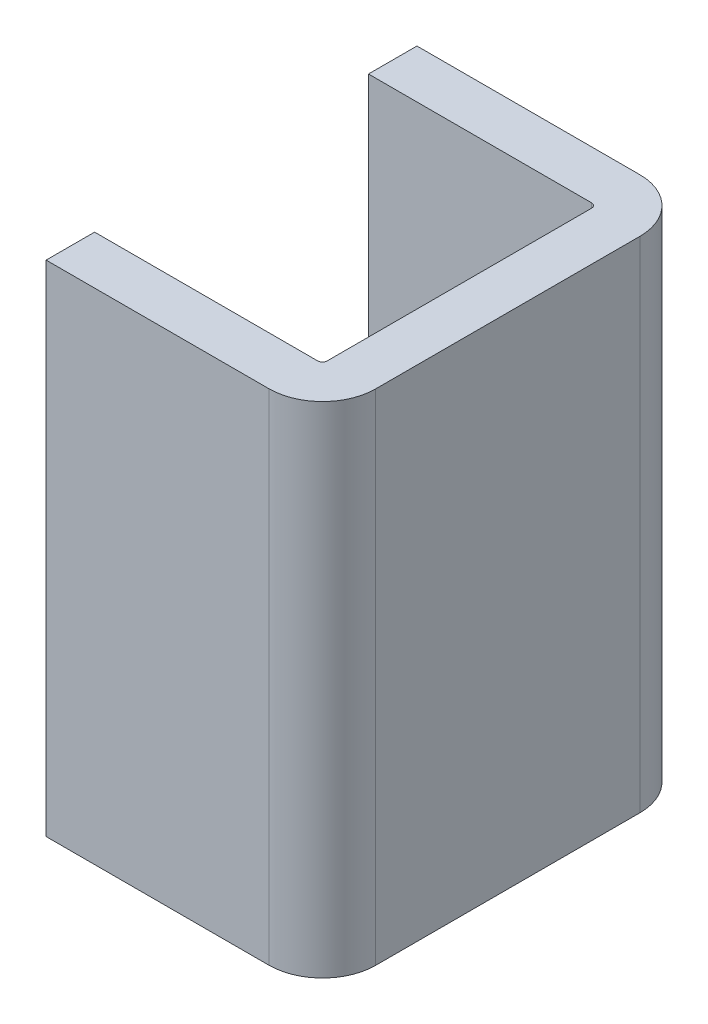
ISO-10303-21;
HEADER;
FILE_DESCRIPTION(('STEP AP214'),'2;1');
FILE_NAME('part.step','',(''),(''),'','','');
FILE_SCHEMA(('AUTOMOTIVE_DESIGN { 1 0 10303 214 1 1 1 1 }'));
ENDSEC;
DATA;
#1=APPLICATION_CONTEXT('core data for automotive mechanical design processes');
#2=APPLICATION_PROTOCOL_DEFINITION('international standard','automotive_design',2000,#1);
#3=PRODUCT_CONTEXT('',#1,'mechanical');
#4=PRODUCT('Part','Part','',(#3));
#5=PRODUCT_RELATED_PRODUCT_CATEGORY('part','',(#4));
#6=PRODUCT_DEFINITION_FORMATION('','',#4);
#7=PRODUCT_DEFINITION_CONTEXT('part definition',#1,'design');
#8=PRODUCT_DEFINITION('design','',#6,#7);
#9=PRODUCT_DEFINITION_SHAPE('','',#8);
#10=(LENGTH_UNIT() NAMED_UNIT(*) SI_UNIT(.MILLI.,.METRE.));
#11=(NAMED_UNIT(*) PLANE_ANGLE_UNIT() SI_UNIT($,.RADIAN.));
#12=(NAMED_UNIT(*) SI_UNIT($,.STERADIAN.) SOLID_ANGLE_UNIT());
#13=UNCERTAINTY_MEASURE_WITH_UNIT(LENGTH_MEASURE(1.E-05),#10,'distance_accuracy_value','');
#14=(GEOMETRIC_REPRESENTATION_CONTEXT(3) GLOBAL_UNCERTAINTY_ASSIGNED_CONTEXT((#13)) GLOBAL_UNIT_ASSIGNED_CONTEXT((#10,
#11,#12)) REPRESENTATION_CONTEXT('',''));
#15=CARTESIAN_POINT('',(0.,0.,0.));
#16=DIRECTION('',(0.,0.,1.));
#17=DIRECTION('',(1.,0.,0.));
#18=AXIS2_PLACEMENT_3D('',#15,#16,#17);
#19=CARTESIAN_POINT('',(1.14,1.03,1.31));
#20=DIRECTION('',(-1.,0.,0.));
#21=DIRECTION('',(0.,0.,1.));
#22=AXIS2_PLACEMENT_3D('',#19,#20,#21);
#23=PLANE('',#22);
#24=DIRECTION('',(0.,0.,1.));
#25=VECTOR('',#24,1.);
#26=CARTESIAN_POINT('',(1.14,1.03,1.31));
#27=LINE('',#26,#25);
#28=CARTESIAN_POINT('',(1.14,1.03,1.31));
#29=VERTEX_POINT('',#28);
#30=CARTESIAN_POINT('',(1.14,1.03,0.22));
#31=VERTEX_POINT('',#30);
#32=EDGE_CURVE('E196',#29,#31,#27,.F.);
#33=ORIENTED_EDGE('',*,*,#32,.F.);
#34=DIRECTION('',(0.,1.,0.));
#35=VECTOR('',#34,1.);
#36=CARTESIAN_POINT('',(1.14,1.03,1.31));
#37=LINE('',#36,#35);
#38=CARTESIAN_POINT('',(1.14,-1.03,1.31));
#39=VERTEX_POINT('',#38);
#40=EDGE_CURVE('E205',#39,#29,#37,.T.);
#41=ORIENTED_EDGE('',*,*,#40,.F.);
#42=DIRECTION('',(0.,0.,1.));
#43=VECTOR('',#42,1.);
#44=CARTESIAN_POINT('',(1.14,-1.03,1.31));
#45=LINE('',#44,#43);
#46=CARTESIAN_POINT('',(1.14,-1.03,0.22));
#47=VERTEX_POINT('',#46);
#48=EDGE_CURVE('E199',#47,#39,#45,.T.);
#49=ORIENTED_EDGE('',*,*,#48,.F.);
#50=DIRECTION('',(0.,1.,0.));
#51=VECTOR('',#50,1.);
#52=CARTESIAN_POINT('',(1.14,1.03,0.22));
#53=LINE('',#52,#51);
#54=EDGE_CURVE('E191',#31,#47,#53,.F.);
#55=ORIENTED_EDGE('',*,*,#54,.F.);
#56=EDGE_LOOP('',(#33,#41,#49,#55));
#57=FACE_BOUND('',#56,.T.);
#58=ADVANCED_FACE('F16',(#57),#23,.F.);
#59=CARTESIAN_POINT('',(0.92,1.03,1.31));
#60=DIRECTION('',(0.,1.,0.));
#61=DIRECTION('',(0.,0.,1.));
#62=AXIS2_PLACEMENT_3D('',#59,#60,#61);
#63=CYLINDRICAL_SURFACE('',#62,0.22);
#64=CARTESIAN_POINT('',(0.92,1.03,1.31));
#65=DIRECTION('',(0.,1.,0.));
#66=DIRECTION('',(0.,0.,1.));
#67=AXIS2_PLACEMENT_3D('',#64,#65,#66);
#68=CIRCLE('',#67,0.22);
#69=CARTESIAN_POINT('',(0.92,1.03,1.53));
#70=VERTEX_POINT('',#69);
#71=EDGE_CURVE('E208',#29,#70,#68,.F.);
#72=ORIENTED_EDGE('',*,*,#71,.T.);
#73=DIRECTION('',(0.,1.,0.));
#74=VECTOR('',#73,1.);
#75=CARTESIAN_POINT('',(0.92,1.03,1.53));
#76=LINE('',#75,#74);
#77=CARTESIAN_POINT('',(0.92,-1.03,1.53));
#78=VERTEX_POINT('',#77);
#79=EDGE_CURVE('E186',#70,#78,#76,.F.);
#80=ORIENTED_EDGE('',*,*,#79,.T.);
#81=CARTESIAN_POINT('',(0.92,-1.03,1.31));
#82=DIRECTION('',(0.,1.,0.));
#83=DIRECTION('',(0.,0.,1.));
#84=AXIS2_PLACEMENT_3D('',#81,#82,#83);
#85=CIRCLE('',#84,0.22);
#86=EDGE_CURVE('E19',#78,#39,#85,.T.);
#87=ORIENTED_EDGE('',*,*,#86,.T.);
#88=ORIENTED_EDGE('',*,*,#40,.T.);
#89=EDGE_LOOP('',(#72,#80,#87,#88));
#90=FACE_BOUND('',#89,.T.);
#91=ADVANCED_FACE('F218',(#90),#63,.T.);
#92=CARTESIAN_POINT('',(0.92,1.03,0.22));
#93=DIRECTION('',(0.,1.,0.));
#94=DIRECTION('',(0.,0.,1.));
#95=AXIS2_PLACEMENT_3D('',#92,#93,#94);
#96=CYLINDRICAL_SURFACE('',#95,0.22);
#97=CARTESIAN_POINT('',(0.92,1.03,0.22));
#98=DIRECTION('',(0.,1.,0.));
#99=DIRECTION('',(0.,0.,1.));
#100=AXIS2_PLACEMENT_3D('',#97,#98,#99);
#101=CIRCLE('',#100,0.22);
#102=CARTESIAN_POINT('',(0.92,1.03,0.));
#103=VERTEX_POINT('',#102);
#104=EDGE_CURVE('E202',#103,#31,#101,.F.);
#105=ORIENTED_EDGE('',*,*,#104,.T.);
#106=ORIENTED_EDGE('',*,*,#54,.T.);
#107=CARTESIAN_POINT('',(0.92,-1.03,0.22));
#108=DIRECTION('',(0.,1.,0.));
#109=DIRECTION('',(0.,0.,1.));
#110=AXIS2_PLACEMENT_3D('',#107,#108,#109);
#111=CIRCLE('',#110,0.22);
#112=CARTESIAN_POINT('',(0.92,-1.03,0.));
#113=VERTEX_POINT('',#112);
#114=EDGE_CURVE('E215',#47,#113,#111,.T.);
#115=ORIENTED_EDGE('',*,*,#114,.T.);
#116=DIRECTION('',(0.,1.,0.));
#117=VECTOR('',#116,1.);
#118=CARTESIAN_POINT('',(0.92,1.03,0.));
#119=LINE('',#118,#117);
#120=EDGE_CURVE('E178',#113,#103,#119,.T.);
#121=ORIENTED_EDGE('',*,*,#120,.T.);
#122=EDGE_LOOP('',(#105,#106,#115,#121));
#123=FACE_BOUND('',#122,.T.);
#124=ADVANCED_FACE('F286',(#123),#96,.T.);
#125=CARTESIAN_POINT('',(0.,1.03,1.53));
#126=DIRECTION('',(0.,0.,-1.));
#127=DIRECTION('',(-1.,0.,0.));
#128=AXIS2_PLACEMENT_3D('',#125,#126,#127);
#129=PLANE('',#128);
#130=DIRECTION('',(1.,0.,0.));
#131=VECTOR('',#130,1.);
#132=CARTESIAN_POINT('',(0.,1.03,1.53));
#133=LINE('',#132,#131);
#134=CARTESIAN_POINT('',(0.,1.03,1.53));
#135=VERTEX_POINT('',#134);
#136=EDGE_CURVE('E176',#70,#135,#133,.F.);
#137=ORIENTED_EDGE('',*,*,#136,.T.);
#138=DIRECTION('',(0.,1.,0.));
#139=VECTOR('',#138,1.);
#140=CARTESIAN_POINT('',(0.,-1.03,1.53));
#141=LINE('',#140,#139);
#142=CARTESIAN_POINT('',(0.,-1.03,1.53));
#143=VERTEX_POINT('',#142);
#144=EDGE_CURVE('E94',#143,#135,#141,.T.);
#145=ORIENTED_EDGE('',*,*,#144,.F.);
#146=DIRECTION('',(-1.,0.,0.));
#147=VECTOR('',#146,1.);
#148=CARTESIAN_POINT('',(0.,-1.03,1.53));
#149=LINE('',#148,#147);
#150=EDGE_CURVE('E88',#78,#143,#149,.T.);
#151=ORIENTED_EDGE('',*,*,#150,.F.);
#152=ORIENTED_EDGE('',*,*,#79,.F.);
#153=EDGE_LOOP('',(#137,#145,#151,#152));
#154=FACE_BOUND('',#153,.T.);
#155=ADVANCED_FACE('F222',(#154),#129,.F.);
#156=CARTESIAN_POINT('',(0.92,1.03,0.));
#157=DIRECTION('',(0.,0.,1.));
#158=DIRECTION('',(1.,0.,0.));
#159=AXIS2_PLACEMENT_3D('',#156,#157,#158);
#160=PLANE('',#159);
#161=DIRECTION('',(1.,0.,0.));
#162=VECTOR('',#161,1.);
#163=CARTESIAN_POINT('',(0.92,1.03,0.));
#164=LINE('',#163,#162);
#165=CARTESIAN_POINT('',(0.,1.03,0.));
#166=VERTEX_POINT('',#165);
#167=EDGE_CURVE('E129',#166,#103,#164,.T.);
#168=ORIENTED_EDGE('',*,*,#167,.T.);
#169=ORIENTED_EDGE('',*,*,#120,.F.);
#170=DIRECTION('',(1.,0.,0.));
#171=VECTOR('',#170,1.);
#172=CARTESIAN_POINT('',(0.92,-1.03,0.));
#173=LINE('',#172,#171);
#174=CARTESIAN_POINT('',(0.,-1.03,0.));
#175=VERTEX_POINT('',#174);
#176=EDGE_CURVE('E152',#113,#175,#173,.F.);
#177=ORIENTED_EDGE('',*,*,#176,.T.);
#178=DIRECTION('',(0.,1.,0.));
#179=VECTOR('',#178,1.);
#180=CARTESIAN_POINT('',(0.,-1.03,0.));
#181=LINE('',#180,#179);
#182=EDGE_CURVE('E134',#175,#166,#181,.T.);
#183=ORIENTED_EDGE('',*,*,#182,.T.);
#184=EDGE_LOOP('',(#168,#169,#177,#183));
#185=FACE_BOUND('',#184,.T.);
#186=ADVANCED_FACE('F280',(#185),#160,.F.);
#187=CARTESIAN_POINT('',(0.,-1.03,1.33));
#188=DIRECTION('',(-1.,0.,0.));
#189=DIRECTION('',(0.,0.,1.));
#190=AXIS2_PLACEMENT_3D('',#187,#188,#189);
#191=PLANE('',#190);
#192=DIRECTION('',(0.,0.,1.));
#193=VECTOR('',#192,1.);
#194=CARTESIAN_POINT('',(0.,1.03,1.33));
#195=LINE('',#194,#193);
#196=CARTESIAN_POINT('',(0.,1.03,1.33));
#197=VERTEX_POINT('',#196);
#198=EDGE_CURVE('E165',#135,#197,#195,.F.);
#199=ORIENTED_EDGE('',*,*,#198,.T.);
#200=DIRECTION('',(0.,1.,0.));
#201=VECTOR('',#200,1.);
#202=CARTESIAN_POINT('',(0.,-1.03,1.33));
#203=LINE('',#202,#201);
#204=CARTESIAN_POINT('',(0.,-1.03,1.33));
#205=VERTEX_POINT('',#204);
#206=EDGE_CURVE('E168',#197,#205,#203,.F.);
#207=ORIENTED_EDGE('',*,*,#206,.T.);
#208=DIRECTION('',(0.,0.,1.));
#209=VECTOR('',#208,1.);
#210=CARTESIAN_POINT('',(0.,-1.03,1.53));
#211=LINE('',#210,#209);
#212=EDGE_CURVE('E161',#205,#143,#211,.T.);
#213=ORIENTED_EDGE('',*,*,#212,.T.);
#214=ORIENTED_EDGE('',*,*,#144,.T.);
#215=EDGE_LOOP('',(#199,#207,#213,#214));
#216=FACE_BOUND('',#215,.T.);
#217=ADVANCED_FACE('F226',(#216),#191,.T.);
#218=CARTESIAN_POINT('',(0.,-1.03,0.2));
#219=DIRECTION('',(1.,0.,0.));
#220=DIRECTION('',(0.,0.,-1.));
#221=AXIS2_PLACEMENT_3D('',#218,#219,#220);
#222=PLANE('',#221);
#223=DIRECTION('',(0.,0.,-1.));
#224=VECTOR('',#223,1.);
#225=CARTESIAN_POINT('',(0.,1.03,0.2));
#226=LINE('',#225,#224);
#227=CARTESIAN_POINT('',(0.,1.03,0.2));
#228=VERTEX_POINT('',#227);
#229=EDGE_CURVE('E125',#166,#228,#226,.F.);
#230=ORIENTED_EDGE('',*,*,#229,.F.);
#231=ORIENTED_EDGE('',*,*,#182,.F.);
#232=DIRECTION('',(0.,0.,-1.));
#233=VECTOR('',#232,1.);
#234=CARTESIAN_POINT('',(0.,-1.03,0.2));
#235=LINE('',#234,#233);
#236=CARTESIAN_POINT('',(0.,-1.03,0.2));
#237=VERTEX_POINT('',#236);
#238=EDGE_CURVE('E138',#237,#175,#235,.T.);
#239=ORIENTED_EDGE('',*,*,#238,.F.);
#240=DIRECTION('',(0.,1.,0.));
#241=VECTOR('',#240,1.);
#242=CARTESIAN_POINT('',(0.,-1.03,0.2));
#243=LINE('',#242,#241);
#244=EDGE_CURVE('E116',#237,#228,#243,.T.);
#245=ORIENTED_EDGE('',*,*,#244,.T.);
#246=EDGE_LOOP('',(#230,#231,#239,#245));
#247=FACE_BOUND('',#246,.T.);
#248=ADVANCED_FACE('F136',(#247),#222,.F.);
#249=CARTESIAN_POINT('',(0.,-1.03,1.33));
#250=DIRECTION('',(0.,0.,1.));
#251=DIRECTION('',(1.,0.,0.));
#252=AXIS2_PLACEMENT_3D('',#249,#250,#251);
#253=PLANE('',#252);
#254=DIRECTION('',(1.,0.,0.));
#255=VECTOR('',#254,1.);
#256=CARTESIAN_POINT('',(0.,-1.03,1.33));
#257=LINE('',#256,#255);
#258=CARTESIAN_POINT('',(0.92,-1.03,1.33));
#259=VERTEX_POINT('',#258);
#260=EDGE_CURVE('E122',#205,#259,#257,.T.);
#261=ORIENTED_EDGE('',*,*,#260,.F.);
#262=ORIENTED_EDGE('',*,*,#206,.F.);
#263=DIRECTION('',(1.,0.,0.));
#264=VECTOR('',#263,1.);
#265=CARTESIAN_POINT('',(0.,1.03,1.33));
#266=LINE('',#265,#264);
#267=CARTESIAN_POINT('',(0.92,1.03,1.33));
#268=VERTEX_POINT('',#267);
#269=EDGE_CURVE('E133',#268,#197,#266,.F.);
#270=ORIENTED_EDGE('',*,*,#269,.F.);
#271=DIRECTION('',(0.,1.,0.));
#272=VECTOR('',#271,1.);
#273=CARTESIAN_POINT('',(0.92,-1.03,1.33));
#274=LINE('',#273,#272);
#275=EDGE_CURVE('E142',#268,#259,#274,.F.);
#276=ORIENTED_EDGE('',*,*,#275,.T.);
#277=EDGE_LOOP('',(#261,#262,#270,#276));
#278=FACE_BOUND('',#277,.T.);
#279=ADVANCED_FACE('F229',(#278),#253,.F.);
#280=CARTESIAN_POINT('',(0.92,-1.03,0.2));
#281=DIRECTION('',(0.,0.,-1.));
#282=DIRECTION('',(-1.,0.,0.));
#283=AXIS2_PLACEMENT_3D('',#280,#281,#282);
#284=PLANE('',#283);
#285=DIRECTION('',(-1.,0.,0.));
#286=VECTOR('',#285,1.);
#287=CARTESIAN_POINT('',(0.92,-1.03,0.2));
#288=LINE('',#287,#286);
#289=CARTESIAN_POINT('',(0.92,-1.03,0.2));
#290=VERTEX_POINT('',#289);
#291=EDGE_CURVE('E121',#290,#237,#288,.T.);
#292=ORIENTED_EDGE('',*,*,#291,.F.);
#293=DIRECTION('',(0.,1.,0.));
#294=VECTOR('',#293,1.);
#295=CARTESIAN_POINT('',(0.92,-1.03,0.2));
#296=LINE('',#295,#294);
#297=CARTESIAN_POINT('',(0.92,1.03,0.2));
#298=VERTEX_POINT('',#297);
#299=EDGE_CURVE('E118',#290,#298,#296,.T.);
#300=ORIENTED_EDGE('',*,*,#299,.T.);
#301=DIRECTION('',(-1.,0.,0.));
#302=VECTOR('',#301,1.);
#303=CARTESIAN_POINT('',(0.92,1.03,0.2));
#304=LINE('',#303,#302);
#305=EDGE_CURVE('E112',#228,#298,#304,.F.);
#306=ORIENTED_EDGE('',*,*,#305,.F.);
#307=ORIENTED_EDGE('',*,*,#244,.F.);
#308=EDGE_LOOP('',(#292,#300,#306,#307));
#309=FACE_BOUND('',#308,.T.);
#310=ADVANCED_FACE('F114',(#309),#284,.F.);
#311=CARTESIAN_POINT('',(0.94,1.03,1.31));
#312=DIRECTION('',(0.,-1.,0.));
#313=DIRECTION('',(0.,0.,-1.));
#314=AXIS2_PLACEMENT_3D('',#311,#312,#313);
#315=PLANE('',#314);
#316=DIRECTION('',(0.,0.,-1.));
#317=VECTOR('',#316,1.);
#318=CARTESIAN_POINT('',(0.94,1.03,1.31));
#319=LINE('',#318,#317);
#320=CARTESIAN_POINT('',(0.94,1.03,0.22));
#321=VERTEX_POINT('',#320);
#322=CARTESIAN_POINT('',(0.94,1.03,1.31));
#323=VERTEX_POINT('',#322);
#324=EDGE_CURVE('E242',#321,#323,#319,.F.);
#325=ORIENTED_EDGE('',*,*,#324,.T.);
#326=CARTESIAN_POINT('',(0.92,1.03,1.31));
#327=DIRECTION('',(0.,1.,0.));
#328=DIRECTION('',(0.,0.,1.));
#329=AXIS2_PLACEMENT_3D('',#326,#327,#328);
#330=CIRCLE('',#329,0.02);
#331=EDGE_CURVE('E139',#323,#268,#330,.F.);
#332=ORIENTED_EDGE('',*,*,#331,.T.);
#333=ORIENTED_EDGE('',*,*,#269,.T.);
#334=ORIENTED_EDGE('',*,*,#198,.F.);
#335=ORIENTED_EDGE('',*,*,#136,.F.);
#336=ORIENTED_EDGE('',*,*,#71,.F.);
#337=ORIENTED_EDGE('',*,*,#32,.T.);
#338=ORIENTED_EDGE('',*,*,#104,.F.);
#339=ORIENTED_EDGE('',*,*,#167,.F.);
#340=ORIENTED_EDGE('',*,*,#229,.T.);
#341=ORIENTED_EDGE('',*,*,#305,.T.);
#342=CARTESIAN_POINT('',(0.92,1.03,0.22));
#343=DIRECTION('',(0.,1.,0.));
#344=DIRECTION('',(0.,0.,1.));
#345=AXIS2_PLACEMENT_3D('',#342,#343,#344);
#346=CIRCLE('',#345,0.02);
#347=EDGE_CURVE('E210',#298,#321,#346,.F.);
#348=ORIENTED_EDGE('',*,*,#347,.T.);
#349=EDGE_LOOP('',(#325,#332,#333,#334,#335,#336,#337,#338,#339,#340,#341,#348));
#350=FACE_BOUND('',#349,.T.);
#351=ADVANCED_FACE('F127',(#350),#315,.F.);
#352=CARTESIAN_POINT('',(0.92,-1.03,1.31));
#353=DIRECTION('',(0.,1.,0.));
#354=DIRECTION('',(0.,0.,1.));
#355=AXIS2_PLACEMENT_3D('',#352,#353,#354);
#356=CYLINDRICAL_SURFACE('',#355,0.02);
#357=CARTESIAN_POINT('',(0.92,-1.03,1.31));
#358=DIRECTION('',(0.,1.,0.));
#359=DIRECTION('',(0.,0.,1.));
#360=AXIS2_PLACEMENT_3D('',#357,#358,#359);
#361=CIRCLE('',#360,0.02);
#362=CARTESIAN_POINT('',(0.94,-1.03,1.31));
#363=VERTEX_POINT('',#362);
#364=EDGE_CURVE('E212',#259,#363,#361,.T.);
#365=ORIENTED_EDGE('',*,*,#364,.F.);
#366=ORIENTED_EDGE('',*,*,#275,.F.);
#367=ORIENTED_EDGE('',*,*,#331,.F.);
#368=DIRECTION('',(0.,1.,0.));
#369=VECTOR('',#368,1.);
#370=CARTESIAN_POINT('',(0.94,-1.03,1.31));
#371=LINE('',#370,#369);
#372=EDGE_CURVE('E239',#323,#363,#371,.F.);
#373=ORIENTED_EDGE('',*,*,#372,.T.);
#374=EDGE_LOOP('',(#365,#366,#367,#373));
#375=FACE_BOUND('',#374,.T.);
#376=ADVANCED_FACE('F256',(#375),#356,.F.);
#377=CARTESIAN_POINT('',(1.14,-1.03,1.31));
#378=DIRECTION('',(0.,1.,0.));
#379=DIRECTION('',(0.,0.,1.));
#380=AXIS2_PLACEMENT_3D('',#377,#378,#379);
#381=PLANE('',#380);
#382=ORIENTED_EDGE('',*,*,#48,.T.);
#383=ORIENTED_EDGE('',*,*,#86,.F.);
#384=ORIENTED_EDGE('',*,*,#150,.T.);
#385=ORIENTED_EDGE('',*,*,#212,.F.);
#386=ORIENTED_EDGE('',*,*,#260,.T.);
#387=ORIENTED_EDGE('',*,*,#364,.T.);
#388=DIRECTION('',(0.,0.,-1.));
#389=VECTOR('',#388,1.);
#390=CARTESIAN_POINT('',(0.94,-1.03,1.31));
#391=LINE('',#390,#389);
#392=CARTESIAN_POINT('',(0.94,-1.03,0.22));
#393=VERTEX_POINT('',#392);
#394=EDGE_CURVE('E25',#363,#393,#391,.T.);
#395=ORIENTED_EDGE('',*,*,#394,.T.);
#396=CARTESIAN_POINT('',(0.92,-1.03,0.22));
#397=DIRECTION('',(0.,1.,0.));
#398=DIRECTION('',(0.,0.,1.));
#399=AXIS2_PLACEMENT_3D('',#396,#397,#398);
#400=CIRCLE('',#399,0.02);
#401=EDGE_CURVE('E33',#393,#290,#400,.T.);
#402=ORIENTED_EDGE('',*,*,#401,.T.);
#403=ORIENTED_EDGE('',*,*,#291,.T.);
#404=ORIENTED_EDGE('',*,*,#238,.T.);
#405=ORIENTED_EDGE('',*,*,#176,.F.);
#406=ORIENTED_EDGE('',*,*,#114,.F.);
#407=EDGE_LOOP('',(#382,#383,#384,#385,#386,#387,#395,#402,#403,#404,#405,#406));
#408=FACE_BOUND('',#407,.T.);
#409=ADVANCED_FACE('F251',(#408),#381,.F.);
#410=CARTESIAN_POINT('',(0.92,-1.03,0.22));
#411=DIRECTION('',(0.,1.,0.));
#412=DIRECTION('',(0.,0.,1.));
#413=AXIS2_PLACEMENT_3D('',#410,#411,#412);
#414=CYLINDRICAL_SURFACE('',#413,0.02);
#415=ORIENTED_EDGE('',*,*,#401,.F.);
#416=DIRECTION('',(0.,1.,0.));
#417=VECTOR('',#416,1.);
#418=CARTESIAN_POINT('',(0.94,-1.03,0.22));
#419=LINE('',#418,#417);
#420=EDGE_CURVE('E11',#393,#321,#419,.T.);
#421=ORIENTED_EDGE('',*,*,#420,.T.);
#422=ORIENTED_EDGE('',*,*,#347,.F.);
#423=ORIENTED_EDGE('',*,*,#299,.F.);
#424=EDGE_LOOP('',(#415,#421,#422,#423));
#425=FACE_BOUND('',#424,.T.);
#426=ADVANCED_FACE('F257',(#425),#414,.F.);
#427=CARTESIAN_POINT('',(0.94,-1.03,1.31));
#428=DIRECTION('',(1.,0.,0.));
#429=DIRECTION('',(0.,0.,-1.));
#430=AXIS2_PLACEMENT_3D('',#427,#428,#429);
#431=PLANE('',#430);
#432=ORIENTED_EDGE('',*,*,#394,.F.);
#433=ORIENTED_EDGE('',*,*,#372,.F.);
#434=ORIENTED_EDGE('',*,*,#324,.F.);
#435=ORIENTED_EDGE('',*,*,#420,.F.);
#436=EDGE_LOOP('',(#432,#433,#434,#435));
#437=FACE_BOUND('',#436,.T.);
#438=ADVANCED_FACE('F254',(#437),#431,.F.);
#439=CLOSED_SHELL('',(#58,#91,#124,#155,#186,#217,#248,#279,#310,#351,#376,#409,#426,#438));
#440=MANIFOLD_SOLID_BREP('B1',#439);
#441=ADVANCED_BREP_SHAPE_REPRESENTATION('',(#18,#440),#14);
#442=SHAPE_DEFINITION_REPRESENTATION(#9,#441);
ENDSEC;
END-ISO-10303-21;
